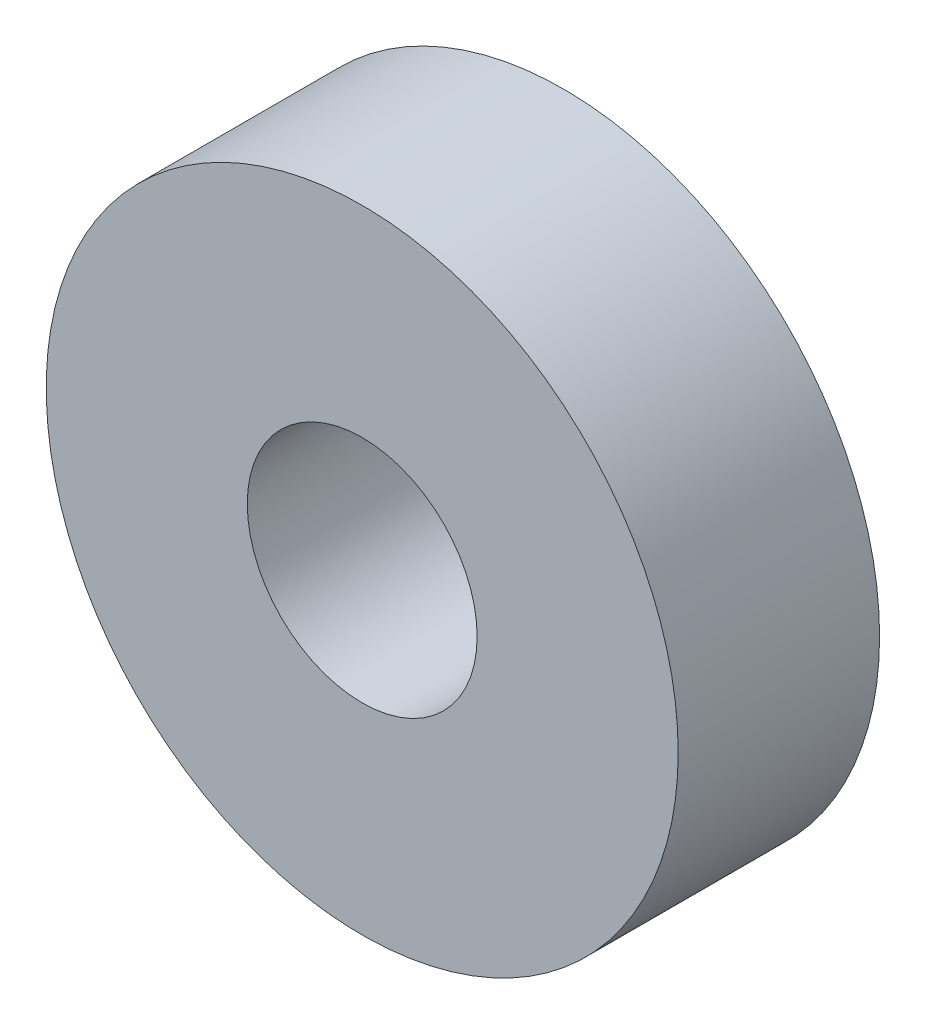
ISO-10303-21;
HEADER;
FILE_DESCRIPTION(('STEP AP214'),'2;1');
FILE_NAME('part.step','',(''),(''),'','','');
FILE_SCHEMA(('AUTOMOTIVE_DESIGN { 1 0 10303 214 1 1 1 1 }'));
ENDSEC;
DATA;
#1=APPLICATION_CONTEXT('core data for automotive mechanical design processes');
#2=APPLICATION_PROTOCOL_DEFINITION('international standard','automotive_design',2000,#1);
#3=PRODUCT_CONTEXT('',#1,'mechanical');
#4=PRODUCT('Part','Part','',(#3));
#5=PRODUCT_RELATED_PRODUCT_CATEGORY('part','',(#4));
#6=PRODUCT_DEFINITION_FORMATION('','',#4);
#7=PRODUCT_DEFINITION_CONTEXT('part definition',#1,'design');
#8=PRODUCT_DEFINITION('design','',#6,#7);
#9=PRODUCT_DEFINITION_SHAPE('','',#8);
#10=(LENGTH_UNIT() NAMED_UNIT(*) SI_UNIT(.MILLI.,.METRE.));
#11=(NAMED_UNIT(*) PLANE_ANGLE_UNIT() SI_UNIT($,.RADIAN.));
#12=(NAMED_UNIT(*) SI_UNIT($,.STERADIAN.) SOLID_ANGLE_UNIT());
#13=UNCERTAINTY_MEASURE_WITH_UNIT(LENGTH_MEASURE(1.E-05),#10,'distance_accuracy_value','');
#14=(GEOMETRIC_REPRESENTATION_CONTEXT(3) GLOBAL_UNCERTAINTY_ASSIGNED_CONTEXT((#13)) GLOBAL_UNIT_ASSIGNED_CONTEXT((#10,
#11,#12)) REPRESENTATION_CONTEXT('',''));
#15=CARTESIAN_POINT('',(0.,0.,0.));
#16=DIRECTION('',(0.,0.,1.));
#17=DIRECTION('',(1.,0.,0.));
#18=AXIS2_PLACEMENT_3D('',#15,#16,#17);
#19=CARTESIAN_POINT('',(0.,0.,3.5052));
#20=DIRECTION('',(0.,0.,-1.));
#21=DIRECTION('',(-1.,0.,0.));
#22=AXIS2_PLACEMENT_3D('',#19,#20,#21);
#23=CYLINDRICAL_SURFACE('',#22,10.9982);
#24=CARTESIAN_POINT('',(0.,0.,3.5052));
#25=DIRECTION('',(0.,0.,1.));
#26=DIRECTION('',(1.,0.,0.));
#27=AXIS2_PLACEMENT_3D('',#24,#25,#26);
#28=CIRCLE('',#27,10.9982);
#29=CARTESIAN_POINT('',(10.9982,0.,3.5052));
#30=VERTEX_POINT('',#29);
#31=EDGE_CURVE('E10',#30,#30,#28,.T.);
#32=ORIENTED_EDGE('',*,*,#31,.F.);
#33=EDGE_LOOP('',(#32));
#34=FACE_BOUND('',#33,.T.);
#35=CARTESIAN_POINT('',(0.,0.,-3.5052));
#36=DIRECTION('',(0.,0.,1.));
#37=DIRECTION('',(1.,0.,0.));
#38=AXIS2_PLACEMENT_3D('',#35,#36,#37);
#39=CIRCLE('',#38,10.9982);
#40=CARTESIAN_POINT('',(10.9982,0.,-3.5052));
#41=VERTEX_POINT('',#40);
#42=EDGE_CURVE('E51',#41,#41,#39,.T.);
#43=ORIENTED_EDGE('',*,*,#42,.T.);
#44=EDGE_LOOP('',(#43));
#45=FACE_BOUND('',#44,.T.);
#46=ADVANCED_FACE('F43',(#34,#45),#23,.T.);
#47=CARTESIAN_POINT('',(0.,0.,3.5052));
#48=DIRECTION('',(0.,0.,1.));
#49=DIRECTION('',(1.,0.,0.));
#50=AXIS2_PLACEMENT_3D('',#47,#48,#49);
#51=PLANE('',#50);
#52=CARTESIAN_POINT('',(0.,0.,3.5052));
#53=DIRECTION('',(0.,0.,1.));
#54=DIRECTION('',(1.,0.,0.));
#55=AXIS2_PLACEMENT_3D('',#52,#53,#54);
#56=CIRCLE('',#55,4.0005);
#57=CARTESIAN_POINT('',(4.0005,0.,3.5052));
#58=VERTEX_POINT('',#57);
#59=EDGE_CURVE('E57',#58,#58,#56,.F.);
#60=ORIENTED_EDGE('',*,*,#59,.T.);
#61=EDGE_LOOP('',(#60));
#62=FACE_BOUND('',#61,.T.);
#63=ORIENTED_EDGE('',*,*,#31,.T.);
#64=EDGE_LOOP('',(#63));
#65=FACE_BOUND('',#64,.T.);
#66=ADVANCED_FACE('F72',(#62,#65),#51,.T.);
#67=CARTESIAN_POINT('',(0.,0.,-3.5052));
#68=DIRECTION('',(0.,0.,1.));
#69=DIRECTION('',(1.,0.,0.));
#70=AXIS2_PLACEMENT_3D('',#67,#68,#69);
#71=PLANE('',#70);
#72=CARTESIAN_POINT('',(0.,0.,-3.5052));
#73=DIRECTION('',(0.,0.,1.));
#74=DIRECTION('',(1.,0.,0.));
#75=AXIS2_PLACEMENT_3D('',#72,#73,#74);
#76=CIRCLE('',#75,4.0005);
#77=CARTESIAN_POINT('',(4.0005,0.,-3.5052));
#78=VERTEX_POINT('',#77);
#79=EDGE_CURVE('E46',#78,#78,#76,.F.);
#80=ORIENTED_EDGE('',*,*,#79,.F.);
#81=EDGE_LOOP('',(#80));
#82=FACE_BOUND('',#81,.T.);
#83=ORIENTED_EDGE('',*,*,#42,.F.);
#84=EDGE_LOOP('',(#83));
#85=FACE_BOUND('',#84,.T.);
#86=ADVANCED_FACE('F69',(#82,#85),#71,.F.);
#87=CARTESIAN_POINT('',(0.,0.,9.22020000000001));
#88=DIRECTION('',(0.,0.,-1.));
#89=DIRECTION('',(-1.,0.,0.));
#90=AXIS2_PLACEMENT_3D('',#87,#88,#89);
#91=CYLINDRICAL_SURFACE('',#90,4.0005);
#92=ORIENTED_EDGE('',*,*,#59,.F.);
#93=EDGE_LOOP('',(#92));
#94=FACE_BOUND('',#93,.T.);
#95=ORIENTED_EDGE('',*,*,#79,.T.);
#96=EDGE_LOOP('',(#95));
#97=FACE_BOUND('',#96,.T.);
#98=ADVANCED_FACE('F67',(#94,#97),#91,.F.);
#99=CLOSED_SHELL('',(#46,#66,#86,#98));
#100=MANIFOLD_SOLID_BREP('B2',#99);
#101=ADVANCED_BREP_SHAPE_REPRESENTATION('',(#18,#100),#14);
#102=SHAPE_DEFINITION_REPRESENTATION(#9,#101);
ENDSEC;
END-ISO-10303-21;
